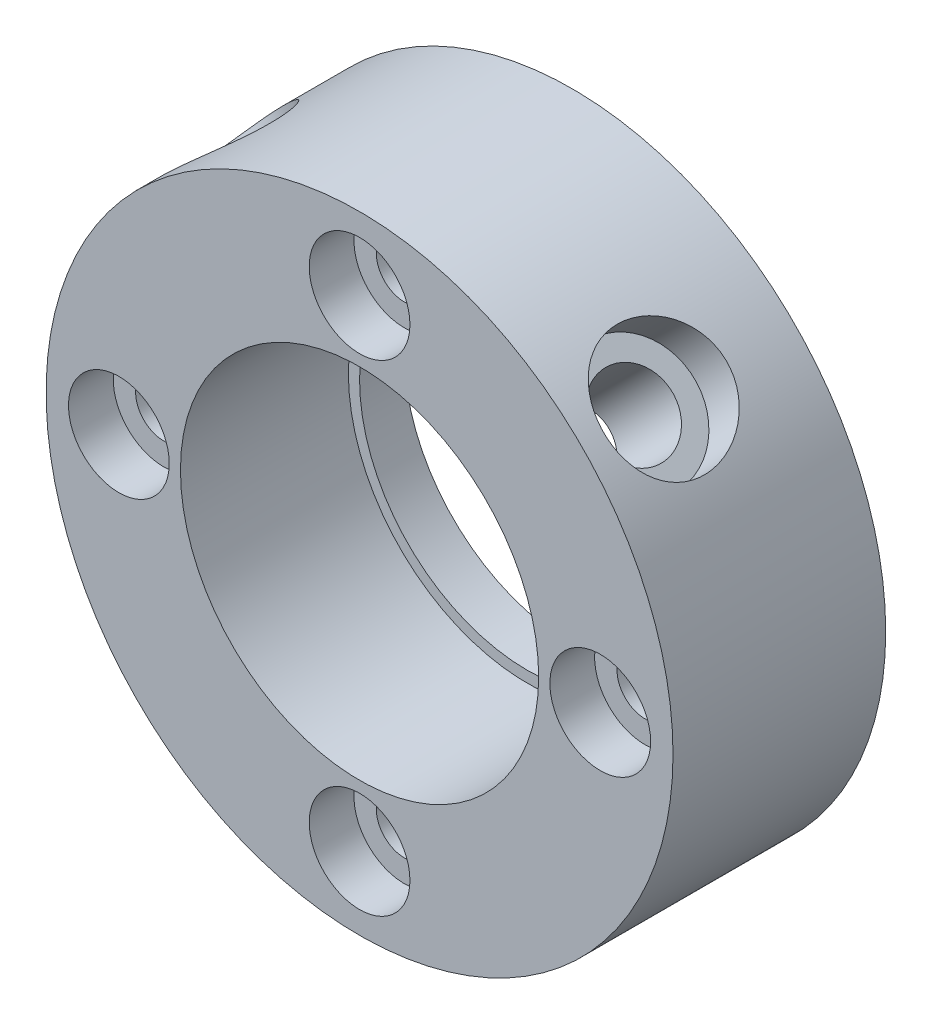
ISO-10303-21;
HEADER;
FILE_DESCRIPTION(('STEP AP214'),'2;1');
FILE_NAME('part.step','',(''),(''),'','','');
FILE_SCHEMA(('AUTOMOTIVE_DESIGN { 1 0 10303 214 1 1 1 1 }'));
ENDSEC;
DATA;
#1=APPLICATION_CONTEXT('core data for automotive mechanical design processes');
#2=APPLICATION_PROTOCOL_DEFINITION('international standard','automotive_design',2000,#1);
#3=PRODUCT_CONTEXT('',#1,'mechanical');
#4=PRODUCT('Part','Part','',(#3));
#5=PRODUCT_RELATED_PRODUCT_CATEGORY('part','',(#4));
#6=PRODUCT_DEFINITION_FORMATION('','',#4);
#7=PRODUCT_DEFINITION_CONTEXT('part definition',#1,'design');
#8=PRODUCT_DEFINITION('design','',#6,#7);
#9=PRODUCT_DEFINITION_SHAPE('','',#8);
#10=(LENGTH_UNIT() NAMED_UNIT(*) SI_UNIT(.MILLI.,.METRE.));
#11=(NAMED_UNIT(*) PLANE_ANGLE_UNIT() SI_UNIT($,.RADIAN.));
#12=(NAMED_UNIT(*) SI_UNIT($,.STERADIAN.) SOLID_ANGLE_UNIT());
#13=UNCERTAINTY_MEASURE_WITH_UNIT(LENGTH_MEASURE(1.E-05),#10,'distance_accuracy_value','');
#14=(GEOMETRIC_REPRESENTATION_CONTEXT(3) GLOBAL_UNCERTAINTY_ASSIGNED_CONTEXT((#13)) GLOBAL_UNIT_ASSIGNED_CONTEXT((#10,
#11,#12)) REPRESENTATION_CONTEXT('',''));
#15=CARTESIAN_POINT('',(0.,0.,0.));
#16=DIRECTION('',(0.,0.,1.));
#17=DIRECTION('',(1.,0.,0.));
#18=AXIS2_PLACEMENT_3D('',#15,#16,#17);
#19=CARTESIAN_POINT('',(-4.94974746830585,4.94974746830582,5.75));
#20=DIRECTION('',(-0.707106781186549,0.707106781186546,0.));
#21=DIRECTION('',(-0.707106781186546,-0.707106781186549,0.));
#22=AXIS2_PLACEMENT_3D('',#19,#20,#21);
#23=CYLINDRICAL_SURFACE('',#22,1.75);
#24=CARTESIAN_POINT('',(-6.75728740853137,4.28241367437843,5.75));
#25=CARTESIAN_POINT('',(-6.7572864358189,4.28241742043915,5.6529719865672));
#26=CARTESIAN_POINT('',(-6.75285509491892,4.28943219210488,5.55590386868923));
#27=CARTESIAN_POINT('',(-6.73515694329336,4.31716593041878,5.36452809547803));
#28=CARTESIAN_POINT('',(-6.72188374551932,4.33789480358069,5.2702224871333));
#29=CARTESIAN_POINT('',(-6.68662088146166,4.39205386093303,5.08716775159997));
#30=CARTESIAN_POINT('',(-6.66464077981807,4.42547010622337,4.99841265057484));
#31=CARTESIAN_POINT('',(-6.6121370674966,4.50353711713558,4.82873191615454));
#32=CARTESIAN_POINT('',(-6.58161363249329,4.54818765174743,4.74780612181319));
#33=CARTESIAN_POINT('',(-6.5117506986383,4.64767071106652,4.59471253780589));
#34=CARTESIAN_POINT('',(-6.47228443683237,4.70264747442849,4.52269629807493));
#35=CARTESIAN_POINT('',(-6.38521848127704,4.82019972127882,4.39079338749152));
#36=CARTESIAN_POINT('',(-6.33761815575134,4.88277579489965,4.33090765961146));
#37=CARTESIAN_POINT('',(-6.23438082445478,5.0139328586227,4.22436623233176));
#38=CARTESIAN_POINT('',(-6.17866456268551,5.08257008051205,4.17785629524105));
#39=CARTESIAN_POINT('',(-6.06058047843026,5.22281107829635,4.10032973697399));
#40=CARTESIAN_POINT('',(-5.99821340344953,5.29441452025671,4.06931137687435));
#41=CARTESIAN_POINT('',(-5.86926128775424,5.43699018131876,4.0241251174166));
#42=CARTESIAN_POINT('',(-5.80275767898808,5.50795470371953,4.00970073060677));
#43=CARTESIAN_POINT('',(-5.66643300556401,5.64810486238766,3.99730994048858));
#44=CARTESIAN_POINT('',(-5.59661232141431,5.7172907012948,3.99934165397865));
#45=CARTESIAN_POINT('',(-5.45694065885707,5.85072421217797,4.01961437044523));
#46=CARTESIAN_POINT('',(-5.38711042051306,5.91503588865531,4.03757891107517));
#47=CARTESIAN_POINT('',(-5.2484313985945,6.03842596202248,4.0887667801185));
#48=CARTESIAN_POINT('',(-5.17958265954779,6.09750412211241,4.12199079855425));
#49=CARTESIAN_POINT('',(-5.04462045156653,6.2096349145785,4.2029990480669));
#50=CARTESIAN_POINT('',(-4.97853069129534,6.26264027931818,4.25088806992256));
#51=CARTESIAN_POINT('',(-4.85187975514392,6.36126682027887,4.35978878699777));
#52=CARTESIAN_POINT('',(-4.7913193341689,6.40688698887505,4.42080227025849));
#53=CARTESIAN_POINT('',(-4.6767093904802,6.49103666483952,4.55572505085902));
#54=CARTESIAN_POINT('',(-4.62282160112356,6.52939884402311,4.62987630560751));
#55=CARTESIAN_POINT('',(-4.52519370150899,6.59743687627675,4.78817892039438));
#56=CARTESIAN_POINT('',(-4.48145386643818,6.6271124937947,4.87233055152438));
#57=CARTESIAN_POINT('',(-4.40587953681626,6.67759738871819,5.04862144608706));
#58=CARTESIAN_POINT('',(-4.37408071094507,6.69838012782498,5.14078364370769));
#59=CARTESIAN_POINT('',(-4.32406351384026,6.73077796444658,5.33025868273823));
#60=CARTESIAN_POINT('',(-4.30584298783509,6.74239451658183,5.42757070428457));
#61=CARTESIAN_POINT('',(-4.28410636016127,6.75622653145643,5.6224569275024));
#62=CARTESIAN_POINT('',(-4.28029798613782,6.75862886838208,5.7199853182606));
#63=CARTESIAN_POINT('',(-4.28676262845681,6.75453036478645,5.9143807036213));
#64=CARTESIAN_POINT('',(-4.29703467722516,6.74803013602893,6.01124774321065));
#65=CARTESIAN_POINT('',(-4.33095199526394,6.72631015249794,6.20039091520493));
#66=CARTESIAN_POINT('',(-4.3544374889898,6.71119454594867,6.29270782401673));
#67=CARTESIAN_POINT('',(-4.41359430759669,6.67243793646259,6.4714579700726));
#68=CARTESIAN_POINT('',(-4.44926679906692,6.64879611734983,6.55789064310333));
#69=CARTESIAN_POINT('',(-4.53192156437374,6.59273913643557,6.72388497843437));
#70=CARTESIAN_POINT('',(-4.57906951618442,6.56019449772474,6.80332035921827));
#71=CARTESIAN_POINT('',(-4.68248056226202,6.48678561819451,6.95173168369394));
#72=CARTESIAN_POINT('',(-4.73874478865659,6.4459203438939,7.02070632623003));
#73=CARTESIAN_POINT('',(-4.85940010318161,6.35547083683945,7.14755337012295));
#74=CARTESIAN_POINT('',(-4.92392316242068,6.30573823908874,7.20519478022894));
#75=CARTESIAN_POINT('',(-5.05786425533932,6.19881772864504,7.30608724272948));
#76=CARTESIAN_POINT('',(-5.12728206021031,6.14163016433416,7.349338967241));
#77=CARTESIAN_POINT('',(-5.26809773476028,6.0212674911324,7.41990264693481));
#78=CARTESIAN_POINT('',(-5.33947995074544,5.95813336776877,7.44731558387298));
#79=CARTESIAN_POINT('',(-5.48223283765318,5.82704937705271,7.4857388611449));
#80=CARTESIAN_POINT('',(-5.55360350874495,5.7591002114348,7.49675158648308));
#81=CARTESIAN_POINT('',(-5.69260216321536,5.62171092173696,7.50195457827283));
#82=CARTESIAN_POINT('',(-5.76027710418475,5.55233113744565,7.49648972318037));
#83=CARTESIAN_POINT('',(-5.89156954835449,5.4128168134945,7.46966411740783));
#84=CARTESIAN_POINT('',(-5.95518712449669,5.34268228742965,7.44830365258081));
#85=CARTESIAN_POINT('',(-6.07664791203298,5.2041156005644,7.39045845606348));
#86=CARTESIAN_POINT('',(-6.13450905774763,5.1356786852191,7.35402264734774));
#87=CARTESIAN_POINT('',(-6.24357328681382,5.0025202413903,7.26710874006052));
#88=CARTESIAN_POINT('',(-6.29477572302233,4.93779907437181,7.21662927811655));
#89=CARTESIAN_POINT('',(-6.39064384827594,4.81310512931095,7.10193650784483));
#90=CARTESIAN_POINT('',(-6.43516700216799,4.7532458099922,7.03748068449274));
#91=CARTESIAN_POINT('',(-6.51595605704299,4.64188119877392,6.89715399963899));
#92=CARTESIAN_POINT('',(-6.55221996499043,4.59037792412896,6.82128039023581));
#93=CARTESIAN_POINT('',(-6.61655938010037,4.49715481968186,6.6590516072625));
#94=CARTESIAN_POINT('',(-6.64451888710902,4.45557504840139,6.57256982229047));
#95=CARTESIAN_POINT('',(-6.69133209768394,4.38496104880476,6.39237797670048));
#96=CARTESIAN_POINT('',(-6.71019350772666,4.35591620507398,6.29867411180724));
#97=CARTESIAN_POINT('',(-6.73537258309256,4.31684547391851,6.12906263930061));
#98=CARTESIAN_POINT('',(-6.74358595705933,4.30396939286267,6.05407494852323));
#99=CARTESIAN_POINT('',(-6.7545436193223,4.28675222671176,5.90273307766719));
#100=CARTESIAN_POINT('',(-6.75728817423572,4.28241072553687,5.82637896438781));
#101=CARTESIAN_POINT('',(-6.75728740853137,4.28241367437843,5.75));
#102=B_SPLINE_CURVE_WITH_KNOTS('',3,(#24,#25,#26,#27,#28,#29,#30,#31,#32,#33,#34,#35,#36,#37,
#38,#39,#40,#41,#42,#43,#44,#45,#46,#47,#48,#49,#50,#51,#52,#53,#54,#55,#56,#57,#58,#59,#60,#61,
#62,#63,#64,#65,#66,#67,#68,#69,#70,#71,#72,#73,#74,#75,#76,#77,#78,#79,#80,#81,#82,#83,#84,#85,
#86,#87,#88,#89,#90,#91,#92,#93,#94,#95,#96,#97,#98,#99,#100,#101),.UNSPECIFIED.,.T.,.F.,(4,2,2,
2,2,2,2,2,2,2,2,2,2,2,2,2,2,2,2,2,2,2,2,2,2,2,2,2,2,2,2,2,2,2,2,2,2,2,4),(0.,0.290804115870691,
0.581818526599535,0.872514137052688,1.16320377043854,1.45830491896335,1.75342899855111,
2.05165686348641,2.34985124493559,2.64337184515389,2.93685885596571,3.2253508676411,
3.51385592599757,3.8044726414071,4.09512897475707,4.39183436537594,4.68854780096224,
4.98614062158782,5.28368620646371,5.57516431760517,5.86662240004893,6.15462969113393,
6.44266455918166,6.7351342450112,7.02764027980829,7.32560034403599,7.62354648911712,
7.91957146995089,8.21555339708043,8.50538367763981,8.79520874626514,9.08410055231566,
9.37302041407615,9.66742474155351,9.96190003653334,10.2603137141584,10.5584741768494,
10.7874018788084,11.0163184197546),.UNSPECIFIED.);
#103=CARTESIAN_POINT('',(-6.75728740853137,4.28241367437843,5.75));
#104=VERTEX_POINT('',#103);
#105=EDGE_CURVE('E115',#104,#104,#102,.T.);
#106=ORIENTED_EDGE('',*,*,#105,.T.);
#107=EDGE_LOOP('',(#106));
#108=FACE_BOUND('',#107,.T.);
#109=CARTESIAN_POINT('',(-8.48528137423859,8.48528137423855,5.75));
#110=DIRECTION('',(-0.707106781186549,0.707106781186546,0.));
#111=DIRECTION('',(-0.707106781186546,-0.707106781186549,0.));
#112=AXIS2_PLACEMENT_3D('',#109,#110,#111);
#113=CIRCLE('',#112,1.75);
#114=CARTESIAN_POINT('',(-9.72271824131504,7.24784450716209,5.75));
#115=VERTEX_POINT('',#114);
#116=EDGE_CURVE('E66',#115,#115,#113,.F.);
#117=ORIENTED_EDGE('',*,*,#116,.F.);
#118=EDGE_LOOP('',(#117));
#119=FACE_BOUND('',#118,.T.);
#120=ADVANCED_FACE('F36',(#108,#119),#23,.F.);
#121=CARTESIAN_POINT('',(4.94974746830582,4.94974746830584,5.75));
#122=DIRECTION('',(0.707106781186546,0.707106781186549,0.));
#123=DIRECTION('',(-0.707106781186549,0.707106781186546,0.));
#124=AXIS2_PLACEMENT_3D('',#121,#122,#123);
#125=CYLINDRICAL_SURFACE('',#124,1.75);
#126=CARTESIAN_POINT('',(4.28241367437843,6.75728740853137,5.75));
#127=CARTESIAN_POINT('',(4.28241742043916,6.7572864358189,5.6529719865672));
#128=CARTESIAN_POINT('',(4.28943219210489,6.75285509491892,5.55590386868923));
#129=CARTESIAN_POINT('',(4.31716593041878,6.73515694329336,5.36452809547803));
#130=CARTESIAN_POINT('',(4.33789480358069,6.72188374551932,5.2702224871333));
#131=CARTESIAN_POINT('',(4.39205386093303,6.68662088146166,5.08716775159997));
#132=CARTESIAN_POINT('',(4.42547010622338,6.66464077981807,4.99841265057484));
#133=CARTESIAN_POINT('',(4.50353711713558,6.6121370674966,4.82873191615454));
#134=CARTESIAN_POINT('',(4.54818765174744,6.58161363249329,4.74780612181319));
#135=CARTESIAN_POINT('',(4.64767071106652,6.5117506986383,4.59471253780589));
#136=CARTESIAN_POINT('',(4.70264747442849,6.47228443683237,4.52269629807493));
#137=CARTESIAN_POINT('',(4.82019972127882,6.38521848127704,4.39079338749152));
#138=CARTESIAN_POINT('',(4.88277579489965,6.33761815575134,4.33090765961146));
#139=CARTESIAN_POINT('',(5.0139328586227,6.23438082445478,4.22436623233177));
#140=CARTESIAN_POINT('',(5.08257008051205,6.17866456268551,4.17785629524105));
#141=CARTESIAN_POINT('',(5.22281107829635,6.06058047843026,4.10032973697399));
#142=CARTESIAN_POINT('',(5.29441452025671,5.99821340344953,4.06931137687435));
#143=CARTESIAN_POINT('',(5.43699018131876,5.86926128775424,4.0241251174166));
#144=CARTESIAN_POINT('',(5.50795470371953,5.80275767898808,4.00970073060678));
#145=CARTESIAN_POINT('',(5.64810486238766,5.66643300556401,3.99730994048858));
#146=CARTESIAN_POINT('',(5.7172907012948,5.59661232141432,3.99934165397865));
#147=CARTESIAN_POINT('',(5.85072421217797,5.45694065885707,4.01961437044523));
#148=CARTESIAN_POINT('',(5.91503588865531,5.38711042051306,4.03757891107517));
#149=CARTESIAN_POINT('',(6.03842596202248,5.2484313985945,4.0887667801185));
#150=CARTESIAN_POINT('',(6.09750412211241,5.17958265954779,4.12199079855425));
#151=CARTESIAN_POINT('',(6.2096349145785,5.04462045156653,4.2029990480669));
#152=CARTESIAN_POINT('',(6.26264027931818,4.97853069129534,4.25088806992256));
#153=CARTESIAN_POINT('',(6.36126682027887,4.85187975514392,4.35978878699777));
#154=CARTESIAN_POINT('',(6.40688698887505,4.7913193341689,4.42080227025849));
#155=CARTESIAN_POINT('',(6.49103666483952,4.6767093904802,4.55572505085902));
#156=CARTESIAN_POINT('',(6.5293988440231,4.62282160112356,4.62987630560751));
#157=CARTESIAN_POINT('',(6.59743687627675,4.52519370150899,4.78817892039438));
#158=CARTESIAN_POINT('',(6.6271124937947,4.48145386643818,4.87233055152438));
#159=CARTESIAN_POINT('',(6.67759738871819,4.40587953681626,5.04862144608706));
#160=CARTESIAN_POINT('',(6.69838012782498,4.37408071094507,5.14078364370769));
#161=CARTESIAN_POINT('',(6.73077796444658,4.32406351384026,5.33025868273823));
#162=CARTESIAN_POINT('',(6.74239451658183,4.30584298783509,5.42757070428457));
#163=CARTESIAN_POINT('',(6.75622653145643,4.28410636016127,5.6224569275024));
#164=CARTESIAN_POINT('',(6.75862886838208,4.28029798613782,5.71998531826059));
#165=CARTESIAN_POINT('',(6.75453036478645,4.28676262845681,5.9143807036213));
#166=CARTESIAN_POINT('',(6.74803013602893,4.29703467722516,6.01124774321065));
#167=CARTESIAN_POINT('',(6.72631015249794,4.33095199526394,6.20039091520493));
#168=CARTESIAN_POINT('',(6.71119454594867,4.3544374889898,6.29270782401673));
#169=CARTESIAN_POINT('',(6.67243793646259,4.41359430759668,6.4714579700726));
#170=CARTESIAN_POINT('',(6.64879611734983,4.44926679906692,6.55789064310333));
#171=CARTESIAN_POINT('',(6.59273913643557,4.53192156437374,6.72388497843437));
#172=CARTESIAN_POINT('',(6.56019449772474,4.57906951618442,6.80332035921827));
#173=CARTESIAN_POINT('',(6.48678561819451,4.68248056226202,6.95173168369394));
#174=CARTESIAN_POINT('',(6.44592034389391,4.73874478865659,7.02070632623003));
#175=CARTESIAN_POINT('',(6.35547083683945,4.85940010318161,7.14755337012295));
#176=CARTESIAN_POINT('',(6.30573823908874,4.92392316242068,7.20519478022894));
#177=CARTESIAN_POINT('',(6.19881772864504,5.05786425533932,7.30608724272948));
#178=CARTESIAN_POINT('',(6.14163016433417,5.12728206021031,7.349338967241));
#179=CARTESIAN_POINT('',(6.0212674911324,5.26809773476028,7.41990264693481));
#180=CARTESIAN_POINT('',(5.95813336776877,5.33947995074543,7.44731558387298));
#181=CARTESIAN_POINT('',(5.82704937705271,5.48223283765317,7.4857388611449));
#182=CARTESIAN_POINT('',(5.7591002114348,5.55360350874494,7.49675158648308));
#183=CARTESIAN_POINT('',(5.62171092173696,5.69260216321536,7.50195457827283));
#184=CARTESIAN_POINT('',(5.55233113744565,5.76027710418475,7.49648972318037));
#185=CARTESIAN_POINT('',(5.4128168134945,5.89156954835449,7.46966411740783));
#186=CARTESIAN_POINT('',(5.34268228742965,5.95518712449669,7.44830365258081));
#187=CARTESIAN_POINT('',(5.2041156005644,6.07664791203298,7.39045845606348));
#188=CARTESIAN_POINT('',(5.1356786852191,6.13450905774763,7.35402264734775));
#189=CARTESIAN_POINT('',(5.0025202413903,6.24357328681382,7.26710874006052));
#190=CARTESIAN_POINT('',(4.93779907437181,6.29477572302233,7.21662927811655));
#191=CARTESIAN_POINT('',(4.81310512931095,6.39064384827593,7.10193650784483));
#192=CARTESIAN_POINT('',(4.7532458099922,6.43516700216799,7.03748068449274));
#193=CARTESIAN_POINT('',(4.64188119877392,6.51595605704299,6.897153999639));
#194=CARTESIAN_POINT('',(4.59037792412896,6.55221996499043,6.82128039023581));
#195=CARTESIAN_POINT('',(4.49715481968186,6.61655938010037,6.6590516072625));
#196=CARTESIAN_POINT('',(4.45557504840139,6.64451888710902,6.57256982229047));
#197=CARTESIAN_POINT('',(4.38496104880476,6.69133209768394,6.39237797670048));
#198=CARTESIAN_POINT('',(4.35591620507398,6.71019350772666,6.29867411180724));
#199=CARTESIAN_POINT('',(4.31684547391851,6.73537258309256,6.12906263930061));
#200=CARTESIAN_POINT('',(4.30396939286267,6.74358595705933,6.05407494852323));
#201=CARTESIAN_POINT('',(4.28675222671176,6.75454361932229,5.90273307766719));
#202=CARTESIAN_POINT('',(4.28241072553687,6.75728817423571,5.82637896438781));
#203=CARTESIAN_POINT('',(4.28241367437843,6.75728740853137,5.75));
#204=B_SPLINE_CURVE_WITH_KNOTS('',3,(#126,#127,#128,#129,#130,#131,#132,#133,#134,#135,#136,
#137,#138,#139,#140,#141,#142,#143,#144,#145,#146,#147,#148,#149,#150,#151,#152,#153,#154,#155,
#156,#157,#158,#159,#160,#161,#162,#163,#164,#165,#166,#167,#168,#169,#170,#171,#172,#173,#174,
#175,#176,#177,#178,#179,#180,#181,#182,#183,#184,#185,#186,#187,#188,#189,#190,#191,#192,#193,
#194,#195,#196,#197,#198,#199,#200,#201,#202,#203),.UNSPECIFIED.,.T.,.F.,(4,2,2,2,2,2,2,2,2,2,2,
2,2,2,2,2,2,2,2,2,2,2,2,2,2,2,2,2,2,2,2,2,2,2,2,2,2,2,4),(0.,0.290804115870692,
0.581818526599534,0.872514137052688,1.16320377043854,1.45830491896335,1.75342899855111,
2.05165686348641,2.34985124493558,2.64337184515389,2.93685885596571,3.2253508676411,
3.51385592599757,3.8044726414071,4.09512897475707,4.39183436537594,4.68854780096223,
4.98614062158781,5.28368620646371,5.57516431760516,5.86662240004893,6.15462969113392,
6.44266455918165,6.73513424501119,7.02764027980828,7.32560034403598,7.62354648911712,
7.91957146995089,8.21555339708042,8.5053836776398,8.79520874626514,9.08410055231566,
9.37302041407614,9.6674247415535,9.96190003653333,10.2603137141584,10.5584741768494,
10.7874018788084,11.0163184197546),.UNSPECIFIED.);
#205=CARTESIAN_POINT('',(4.28241367437843,6.75728740853137,5.75));
#206=VERTEX_POINT('',#205);
#207=EDGE_CURVE('E123',#206,#206,#204,.T.);
#208=ORIENTED_EDGE('',*,*,#207,.T.);
#209=EDGE_LOOP('',(#208));
#210=FACE_BOUND('',#209,.T.);
#211=CARTESIAN_POINT('',(8.48528137423855,8.48528137423859,5.75));
#212=DIRECTION('',(0.707106781186546,0.707106781186549,0.));
#213=DIRECTION('',(-0.707106781186549,0.707106781186546,0.));
#214=AXIS2_PLACEMENT_3D('',#211,#212,#213);
#215=CIRCLE('',#214,1.75);
#216=CARTESIAN_POINT('',(7.24784450716209,9.72271824131504,5.75));
#217=VERTEX_POINT('',#216);
#218=EDGE_CURVE('E64',#217,#217,#215,.F.);
#219=ORIENTED_EDGE('',*,*,#218,.F.);
#220=EDGE_LOOP('',(#219));
#221=FACE_BOUND('',#220,.T.);
#222=ADVANCED_FACE('F110',(#210,#221),#125,.F.);
#223=CARTESIAN_POINT('',(-10.75,0.,0.));
#224=DIRECTION('',(0.,0.,1.));
#225=DIRECTION('',(1.,0.,0.));
#226=AXIS2_PLACEMENT_3D('',#223,#224,#225);
#227=CYLINDRICAL_SURFACE('',#226,1.25);
#228=CARTESIAN_POINT('',(-10.75,0.,0.));
#229=DIRECTION('',(0.,0.,1.));
#230=DIRECTION('',(1.,0.,0.));
#231=AXIS2_PLACEMENT_3D('',#228,#229,#230);
#232=CIRCLE('',#231,1.25);
#233=CARTESIAN_POINT('',(-9.5,0.,0.));
#234=VERTEX_POINT('',#233);
#235=EDGE_CURVE('E167',#234,#234,#232,.T.);
#236=ORIENTED_EDGE('',*,*,#235,.F.);
#237=EDGE_LOOP('',(#236));
#238=FACE_BOUND('',#237,.T.);
#239=CARTESIAN_POINT('',(-10.75,0.,7.5));
#240=DIRECTION('',(0.,0.,1.));
#241=DIRECTION('',(1.,0.,0.));
#242=AXIS2_PLACEMENT_3D('',#239,#240,#241);
#243=CIRCLE('',#242,1.25);
#244=CARTESIAN_POINT('',(-9.5,0.,7.5));
#245=VERTEX_POINT('',#244);
#246=EDGE_CURVE('E124',#245,#245,#243,.F.);
#247=ORIENTED_EDGE('',*,*,#246,.F.);
#248=EDGE_LOOP('',(#247));
#249=FACE_BOUND('',#248,.T.);
#250=ADVANCED_FACE('F248',(#238,#249),#227,.F.);
#251=CARTESIAN_POINT('',(0.,-10.75,0.));
#252=DIRECTION('',(0.,0.,1.));
#253=DIRECTION('',(1.,0.,0.));
#254=AXIS2_PLACEMENT_3D('',#251,#252,#253);
#255=CYLINDRICAL_SURFACE('',#254,1.25);
#256=CARTESIAN_POINT('',(0.,-10.75,0.));
#257=DIRECTION('',(0.,0.,1.));
#258=DIRECTION('',(1.,0.,0.));
#259=AXIS2_PLACEMENT_3D('',#256,#257,#258);
#260=CIRCLE('',#259,1.25);
#261=CARTESIAN_POINT('',(1.25,-10.75,0.));
#262=VERTEX_POINT('',#261);
#263=EDGE_CURVE('E163',#262,#262,#260,.T.);
#264=ORIENTED_EDGE('',*,*,#263,.F.);
#265=EDGE_LOOP('',(#264));
#266=FACE_BOUND('',#265,.T.);
#267=CARTESIAN_POINT('',(0.,-10.75,7.5));
#268=DIRECTION('',(0.,0.,1.));
#269=DIRECTION('',(1.,0.,0.));
#270=AXIS2_PLACEMENT_3D('',#267,#268,#269);
#271=CIRCLE('',#270,1.25);
#272=CARTESIAN_POINT('',(1.25,-10.75,7.5));
#273=VERTEX_POINT('',#272);
#274=EDGE_CURVE('E284',#273,#273,#271,.F.);
#275=ORIENTED_EDGE('',*,*,#274,.F.);
#276=EDGE_LOOP('',(#275));
#277=FACE_BOUND('',#276,.T.);
#278=ADVANCED_FACE('F253',(#266,#277),#255,.F.);
#279=CARTESIAN_POINT('',(10.75,0.,0.));
#280=DIRECTION('',(0.,0.,1.));
#281=DIRECTION('',(1.,0.,0.));
#282=AXIS2_PLACEMENT_3D('',#279,#280,#281);
#283=CYLINDRICAL_SURFACE('',#282,1.25);
#284=CARTESIAN_POINT('',(10.75,0.,0.));
#285=DIRECTION('',(0.,0.,1.));
#286=DIRECTION('',(1.,0.,0.));
#287=AXIS2_PLACEMENT_3D('',#284,#285,#286);
#288=CIRCLE('',#287,1.25);
#289=CARTESIAN_POINT('',(12.,0.,0.));
#290=VERTEX_POINT('',#289);
#291=EDGE_CURVE('E159',#290,#290,#288,.T.);
#292=ORIENTED_EDGE('',*,*,#291,.F.);
#293=EDGE_LOOP('',(#292));
#294=FACE_BOUND('',#293,.T.);
#295=CARTESIAN_POINT('',(10.75,0.,7.5));
#296=DIRECTION('',(0.,0.,1.));
#297=DIRECTION('',(1.,0.,0.));
#298=AXIS2_PLACEMENT_3D('',#295,#296,#297);
#299=CIRCLE('',#298,1.25);
#300=CARTESIAN_POINT('',(12.,0.,7.5));
#301=VERTEX_POINT('',#300);
#302=EDGE_CURVE('E282',#301,#301,#299,.F.);
#303=ORIENTED_EDGE('',*,*,#302,.F.);
#304=EDGE_LOOP('',(#303));
#305=FACE_BOUND('',#304,.T.);
#306=ADVANCED_FACE('F267',(#294,#305),#283,.F.);
#307=CARTESIAN_POINT('',(0.,10.75,0.));
#308=DIRECTION('',(0.,0.,1.));
#309=DIRECTION('',(1.,0.,0.));
#310=AXIS2_PLACEMENT_3D('',#307,#308,#309);
#311=CYLINDRICAL_SURFACE('',#310,1.25);
#312=CARTESIAN_POINT('',(0.,10.75,0.));
#313=DIRECTION('',(0.,0.,1.));
#314=DIRECTION('',(1.,0.,0.));
#315=AXIS2_PLACEMENT_3D('',#312,#313,#314);
#316=CIRCLE('',#315,1.25);
#317=CARTESIAN_POINT('',(1.25,10.75,0.));
#318=VERTEX_POINT('',#317);
#319=EDGE_CURVE('E155',#318,#318,#316,.T.);
#320=ORIENTED_EDGE('',*,*,#319,.F.);
#321=EDGE_LOOP('',(#320));
#322=FACE_BOUND('',#321,.T.);
#323=CARTESIAN_POINT('',(0.,10.75,7.5));
#324=DIRECTION('',(0.,0.,1.));
#325=DIRECTION('',(1.,0.,0.));
#326=AXIS2_PLACEMENT_3D('',#323,#324,#325);
#327=CIRCLE('',#326,1.25);
#328=CARTESIAN_POINT('',(1.25,10.75,7.5));
#329=VERTEX_POINT('',#328);
#330=EDGE_CURVE('E128',#329,#329,#327,.F.);
#331=ORIENTED_EDGE('',*,*,#330,.F.);
#332=EDGE_LOOP('',(#331));
#333=FACE_BOUND('',#332,.T.);
#334=ADVANCED_FACE('F151',(#322,#333),#311,.F.);
#335=CARTESIAN_POINT('',(0.,0.,2.));
#336=DIRECTION('',(0.,0.,-1.));
#337=DIRECTION('',(-1.,0.,0.));
#338=AXIS2_PLACEMENT_3D('',#335,#336,#337);
#339=CYLINDRICAL_SURFACE('',#338,14.);
#340=CARTESIAN_POINT('',(-11.6511779774216,7.76209068089556,5.75));
#341=CARTESIAN_POINT('',(-11.6511760710743,7.76209685743818,5.59713864487768));
#342=CARTESIAN_POINT('',(-11.6439600918152,7.77295873329219,5.44420467965564));
#343=CARTESIAN_POINT('',(-11.6151562478213,7.81593176789737,5.14265905280335));
#344=CARTESIAN_POINT('',(-11.5935566814567,7.84806022774672,4.99405101331165));
#345=CARTESIAN_POINT('',(-11.5362296800744,7.9320849840361,4.70556360702522));
#346=CARTESIAN_POINT('',(-11.5005160354634,7.9839619830083,4.5656758739027));
#347=CARTESIAN_POINT('',(-11.4153350658881,8.10528188694974,4.29828223466166));
#348=CARTESIAN_POINT('',(-11.3658685973735,8.17472369805544,4.1707755581864));
#349=CARTESIAN_POINT('',(-11.2530317647504,8.32937722105698,3.9300161059738));
#350=CARTESIAN_POINT('',(-11.1894986642951,8.4147715125977,3.81695685091667));
#351=CARTESIAN_POINT('',(-11.0496963781696,8.59752415467707,3.60999006066215));
#352=CARTESIAN_POINT('',(-10.9734263172008,8.69488332733456,3.51608384266932));
#353=CARTESIAN_POINT('',(-10.8086291445262,8.89892412332568,3.34934056719733));
#354=CARTESIAN_POINT('',(-10.7200045154781,9.00567714337162,3.27668699234182));
#355=CARTESIAN_POINT('',(-10.5327025177477,9.22403606803344,3.15569481193111));
#356=CARTESIAN_POINT('',(-10.4340260574771,9.33564153359888,3.10735401150367));
#357=CARTESIAN_POINT('',(-10.2302260166266,9.55850280250496,3.03696085636299));
#358=CARTESIAN_POINT('',(-10.125200430248,9.669744990088,3.01458187495326));
#359=CARTESIAN_POINT('',(-9.91038456070153,9.88978808390079,2.99572894559391));
#360=CARTESIAN_POINT('',(-9.80059472202804,9.99858921644498,2.99925258612951));
#361=CARTESIAN_POINT('',(-9.58102744775139,10.2091500460516,3.0318563354567));
#362=CARTESIAN_POINT('',(-9.47127056618951,10.3109859487607,3.06058465450608));
#363=CARTESIAN_POINT('',(-9.25368197503286,10.5067024995948,3.14222474936271));
#364=CARTESIAN_POINT('',(-9.14585034068459,10.6005828373187,3.19513746825414));
#365=CARTESIAN_POINT('',(-8.93496579021392,10.7789421572765,3.32397297266082));
#366=CARTESIAN_POINT('',(-8.83194610420595,10.8633601811193,3.40003439842101));
#367=CARTESIAN_POINT('',(-8.6348846554936,11.0206482091051,3.57290575092377));
#368=CARTESIAN_POINT('',(-8.54084389264235,11.0935169277635,3.66971798449848));
#369=CARTESIAN_POINT('',(-8.36359389448011,11.2277730733744,3.88327523820785));
#370=CARTESIAN_POINT('',(-8.28059342328153,11.2889467968924,4.00032810568758));
#371=CARTESIAN_POINT('',(-8.13053710814367,11.3974983784731,4.25002375031689));
#372=CARTESIAN_POINT('',(-8.06348154485832,11.4448759937072,4.38266680181535));
#373=CARTESIAN_POINT('',(-7.9479795776025,11.5253898480945,4.66019695454488));
#374=CARTESIAN_POINT('',(-7.89957076518362,11.5584973347093,4.80510807845731));
#375=CARTESIAN_POINT('',(-7.82372493303534,11.6099720242653,5.10281950411177));
#376=CARTESIAN_POINT('',(-7.79628528514657,11.6283410744552,5.25561881462842));
#377=CARTESIAN_POINT('',(-7.76393296601738,11.6499665945253,5.56206569919598));
#378=CARTESIAN_POINT('',(-7.75865572008286,11.6534676558465,5.71565758188245));
#379=CARTESIAN_POINT('',(-7.76987377383254,11.6459909608475,6.02168243713359));
#380=CARTESIAN_POINT('',(-7.78636788530818,11.6350139946901,6.17411547248767));
#381=CARTESIAN_POINT('',(-7.84010957468696,11.5988664947171,6.47205705658004));
#382=CARTESIAN_POINT('',(-7.87716491147389,11.5738274114488,6.61761639167118));
#383=CARTESIAN_POINT('',(-7.97027158902165,11.5099061771373,6.89931251813333));
#384=CARTESIAN_POINT('',(-8.02632444711121,11.4710229203497,7.03544855582098));
#385=CARTESIAN_POINT('',(-8.15593958330598,11.3792359676262,7.29632225600289));
#386=CARTESIAN_POINT('',(-8.229713598075,11.3261617735526,7.42089467042176));
#387=CARTESIAN_POINT('',(-8.39149189120413,11.2068257799823,7.65337678166906));
#388=CARTESIAN_POINT('',(-8.47949757981278,11.1405626734163,7.76128482511373));
#389=CARTESIAN_POINT('',(-8.66788418245452,10.9946423388,7.95900125477127));
#390=CARTESIAN_POINT('',(-8.76842864337674,10.9148017777596,8.04851884805999));
#391=CARTESIAN_POINT('',(-8.97720229742934,10.7437434762889,8.20485372190564));
#392=CARTESIAN_POINT('',(-9.085431175118,10.6525262027513,8.27167193361096));
#393=CARTESIAN_POINT('',(-9.30519361072118,10.4610931191872,8.38028411926557));
#394=CARTESIAN_POINT('',(-9.41670517858037,10.3609307606668,8.42221661584114));
#395=CARTESIAN_POINT('',(-9.63990993584737,10.1535865474959,8.48030692396769));
#396=CARTESIAN_POINT('',(-9.75160310268625,10.0464055084653,8.49646772485652));
#397=CARTESIAN_POINT('',(-9.96983508695565,9.82983362934317,8.50244353036993));
#398=CARTESIAN_POINT('',(-10.0764289582517,9.72051010286401,8.49269630858576));
#399=CARTESIAN_POINT('',(-10.2834877072507,9.50119100225685,8.44809707740773));
#400=CARTESIAN_POINT('',(-10.3839526564767,9.39119543598788,8.41324536103783));
#401=CARTESIAN_POINT('',(-10.5761187560898,9.17424036262302,8.31961812143022));
#402=CARTESIAN_POINT('',(-10.6678380278224,9.06727491541163,8.26089345488584));
#403=CARTESIAN_POINT('',(-10.8409023167005,8.85963471236125,8.12124177050664));
#404=CARTESIAN_POINT('',(-10.9222465491039,8.75896043266396,8.04031307467129));
#405=CARTESIAN_POINT('',(-11.0743849957406,8.56582542357789,7.85706506634693));
#406=CARTESIAN_POINT('',(-11.1449947627056,8.47351738730983,7.75443165263271));
#407=CARTESIAN_POINT('',(-11.2731371218947,8.30227954812328,7.53133486969797));
#408=CARTESIAN_POINT('',(-11.3306666202923,8.2233529113769,7.41086729333251));
#409=CARTESIAN_POINT('',(-11.4324685887437,8.08123775287278,7.15403136397606));
#410=CARTESIAN_POINT('',(-11.476598111931,8.0182200631203,7.0175117382729));
#411=CARTESIAN_POINT('',(-11.550271244279,7.91172932739614,6.73345773398099));
#412=CARTESIAN_POINT('',(-11.5798282437361,7.86823834216193,6.58593361120005));
#413=CARTESIAN_POINT('',(-11.6183350585297,7.81121771647316,6.32337110652133));
#414=CARTESIAN_POINT('',(-11.6306426848372,7.79284092765964,6.20984220063522));
#415=CARTESIAN_POINT('',(-11.6470647322009,7.76827527357894,5.98088929870786));
#416=CARTESIAN_POINT('',(-11.6511794174002,7.7620860153819,5.86546536388394));
#417=CARTESIAN_POINT('',(-11.6511779774216,7.76209068089556,5.75));
#418=B_SPLINE_CURVE_WITH_KNOTS('',3,(#340,#341,#342,#343,#344,#345,#346,#347,#348,#349,#350,
#351,#352,#353,#354,#355,#356,#357,#358,#359,#360,#361,#362,#363,#364,#365,#366,#367,#368,#369,
#370,#371,#372,#373,#374,#375,#376,#377,#378,#379,#380,#381,#382,#383,#384,#385,#386,#387,#388,
#389,#390,#391,#392,#393,#394,#395,#396,#397,#398,#399,#400,#401,#402,#403,#404,#405,#406,#407,
#408,#409,#410,#411,#412,#413,#414,#415,#416,#417),.UNSPECIFIED.,.T.,.F.,(4,2,2,2,2,2,2,2,2,2,2,
2,2,2,2,2,2,2,2,2,2,2,2,2,2,2,2,2,2,2,2,2,2,2,2,2,2,2,4),(0.,0.458161359266158,
0.916695907427622,1.37478353967289,1.83284265114413,2.29650709300992,2.76020341155038,
3.22779223307661,3.69533883473926,4.15693714034928,4.61849247204569,5.07370641763774,
5.52893811606669,5.98695177036365,6.44501636769502,6.91078471215003,7.37656125420932,
7.84327194031395,8.30992412187866,8.76886898779822,9.22778880706281,9.68248845652962,
10.1372244313406,10.5976905575203,11.0582023403144,11.5255141630079,11.9928068138484,
12.4574733411489,12.9220859664357,13.3788980434201,13.8357047885022,14.291543452743,
14.7474165750679,15.2104037928827,15.6735004056529,16.141376409648,16.6088216900946,
16.9549096446048,17.3009864409468),.UNSPECIFIED.);
#419=CARTESIAN_POINT('',(-11.6511779774216,7.76209068089556,5.75));
#420=VERTEX_POINT('',#419);
#421=EDGE_CURVE('E10',#420,#420,#418,.T.);
#422=ORIENTED_EDGE('',*,*,#421,.T.);
#423=EDGE_LOOP('',(#422));
#424=FACE_BOUND('',#423,.T.);
#425=CARTESIAN_POINT('',(7.76209068089556,11.6511779774216,5.75));
#426=CARTESIAN_POINT('',(7.76209685743817,11.6511760710743,5.59713864487768));
#427=CARTESIAN_POINT('',(7.77295873329218,11.6439600918152,5.44420467965564));
#428=CARTESIAN_POINT('',(7.81593176789736,11.6151562478213,5.14265905280335));
#429=CARTESIAN_POINT('',(7.84806022774672,11.5935566814567,4.99405101331165));
#430=CARTESIAN_POINT('',(7.9320849840361,11.5362296800744,4.70556360702522));
#431=CARTESIAN_POINT('',(7.9839619830083,11.5005160354634,4.5656758739027));
#432=CARTESIAN_POINT('',(8.10528188694973,11.4153350658881,4.29828223466165));
#433=CARTESIAN_POINT('',(8.17472369805544,11.3658685973735,4.1707755581864));
#434=CARTESIAN_POINT('',(8.32937722105698,11.2530317647504,3.9300161059738));
#435=CARTESIAN_POINT('',(8.41477151259769,11.1894986642951,3.81695685091667));
#436=CARTESIAN_POINT('',(8.59752415467706,11.0496963781696,3.60999006066215));
#437=CARTESIAN_POINT('',(8.69488332733455,10.9734263172008,3.51608384266932));
#438=CARTESIAN_POINT('',(8.89892412332567,10.8086291445262,3.34934056719733));
#439=CARTESIAN_POINT('',(9.00567714337162,10.7200045154781,3.27668699234182));
#440=CARTESIAN_POINT('',(9.22403606803344,10.5327025177477,3.15569481193111));
#441=CARTESIAN_POINT('',(9.33564153359888,10.4340260574771,3.10735401150367));
#442=CARTESIAN_POINT('',(9.55850280250495,10.2302260166266,3.03696085636299));
#443=CARTESIAN_POINT('',(9.66974499008799,10.125200430248,3.01458187495326));
#444=CARTESIAN_POINT('',(9.88978808390079,9.91038456070153,2.99572894559391));
#445=CARTESIAN_POINT('',(9.99858921644498,9.80059472202804,2.99925258612951));
#446=CARTESIAN_POINT('',(10.2091500460516,9.58102744775139,3.0318563354567));
#447=CARTESIAN_POINT('',(10.3109859487607,9.47127056618951,3.06058465450608));
#448=CARTESIAN_POINT('',(10.5067024995948,9.25368197503287,3.14222474936271));
#449=CARTESIAN_POINT('',(10.6005828373187,9.14585034068459,3.19513746825414));
#450=CARTESIAN_POINT('',(10.7789421572765,8.93496579021392,3.32397297266082));
#451=CARTESIAN_POINT('',(10.8633601811193,8.83194610420596,3.40003439842101));
#452=CARTESIAN_POINT('',(11.0206482091051,8.6348846554936,3.57290575092377));
#453=CARTESIAN_POINT('',(11.0935169277635,8.54084389264235,3.66971798449848));
#454=CARTESIAN_POINT('',(11.2277730733744,8.36359389448011,3.88327523820785));
#455=CARTESIAN_POINT('',(11.2889467968924,8.28059342328153,4.00032810568758));
#456=CARTESIAN_POINT('',(11.3974983784731,8.13053710814367,4.25002375031689));
#457=CARTESIAN_POINT('',(11.4448759937072,8.06348154485832,4.38266680181535));
#458=CARTESIAN_POINT('',(11.5253898480945,7.9479795776025,4.66019695454488));
#459=CARTESIAN_POINT('',(11.5584973347093,7.89957076518363,4.80510807845731));
#460=CARTESIAN_POINT('',(11.6099720242653,7.82372493303534,5.10281950411177));
#461=CARTESIAN_POINT('',(11.6283410744552,7.79628528514657,5.25561881462842));
#462=CARTESIAN_POINT('',(11.6499665945253,7.76393296601738,5.56206569919598));
#463=CARTESIAN_POINT('',(11.6534676558465,7.75865572008286,5.71565758188245));
#464=CARTESIAN_POINT('',(11.6459909608475,7.76987377383254,6.02168243713359));
#465=CARTESIAN_POINT('',(11.6350139946901,7.78636788530818,6.17411547248767));
#466=CARTESIAN_POINT('',(11.5988664947171,7.84010957468696,6.47205705658004));
#467=CARTESIAN_POINT('',(11.5738274114488,7.87716491147389,6.61761639167118));
#468=CARTESIAN_POINT('',(11.5099061771373,7.97027158902165,6.89931251813333));
#469=CARTESIAN_POINT('',(11.4710229203497,8.02632444711121,7.03544855582098));
#470=CARTESIAN_POINT('',(11.3792359676262,8.15593958330598,7.29632225600289));
#471=CARTESIAN_POINT('',(11.3261617735526,8.22971359807501,7.42089467042177));
#472=CARTESIAN_POINT('',(11.2068257799823,8.39149189120414,7.65337678166906));
#473=CARTESIAN_POINT('',(11.1405626734163,8.47949757981278,7.76128482511373));
#474=CARTESIAN_POINT('',(10.9946423388,8.66788418245452,7.95900125477127));
#475=CARTESIAN_POINT('',(10.9148017777596,8.76842864337675,8.04851884805999));
#476=CARTESIAN_POINT('',(10.7437434762889,8.97720229742934,8.20485372190564));
#477=CARTESIAN_POINT('',(10.6525262027513,9.085431175118,8.27167193361096));
#478=CARTESIAN_POINT('',(10.4610931191872,9.30519361072118,8.38028411926557));
#479=CARTESIAN_POINT('',(10.3609307606668,9.41670517858037,8.42221661584114));
#480=CARTESIAN_POINT('',(10.1535865474959,9.63990993584737,8.48030692396769));
#481=CARTESIAN_POINT('',(10.0464055084653,9.75160310268626,8.49646772485652));
#482=CARTESIAN_POINT('',(9.82983362934317,9.96983508695565,8.50244353036994));
#483=CARTESIAN_POINT('',(9.72051010286401,10.0764289582517,8.49269630858576));
#484=CARTESIAN_POINT('',(9.50119100225685,10.2834877072507,8.44809707740773));
#485=CARTESIAN_POINT('',(9.39119543598788,10.3839526564767,8.41324536103783));
#486=CARTESIAN_POINT('',(9.17424036262301,10.5761187560898,8.31961812143022));
#487=CARTESIAN_POINT('',(9.06727491541162,10.6678380278224,8.26089345488584));
#488=CARTESIAN_POINT('',(8.85963471236125,10.8409023167005,8.12124177050664));
#489=CARTESIAN_POINT('',(8.75896043266396,10.9222465491039,8.04031307467129));
#490=CARTESIAN_POINT('',(8.56582542357788,11.0743849957406,7.85706506634693));
#491=CARTESIAN_POINT('',(8.47351738730982,11.1449947627056,7.75443165263271));
#492=CARTESIAN_POINT('',(8.30227954812328,11.2731371218947,7.53133486969797));
#493=CARTESIAN_POINT('',(8.2233529113769,11.3306666202923,7.41086729333251));
#494=CARTESIAN_POINT('',(8.08123775287278,11.4324685887437,7.15403136397606));
#495=CARTESIAN_POINT('',(8.01822006312029,11.476598111931,7.0175117382729));
#496=CARTESIAN_POINT('',(7.91172932739613,11.550271244279,6.73345773398099));
#497=CARTESIAN_POINT('',(7.86823834216192,11.5798282437361,6.58593361120005));
#498=CARTESIAN_POINT('',(7.81121771647315,11.6183350585297,6.32337110652133));
#499=CARTESIAN_POINT('',(7.79284092765964,11.6306426848372,6.20984220063522));
#500=CARTESIAN_POINT('',(7.76827527357894,11.6470647322009,5.98088929870786));
#501=CARTESIAN_POINT('',(7.7620860153819,11.6511794174002,5.86546536388394));
#502=CARTESIAN_POINT('',(7.76209068089556,11.6511779774216,5.75));
#503=B_SPLINE_CURVE_WITH_KNOTS('',3,(#425,#426,#427,#428,#429,#430,#431,#432,#433,#434,#435,
#436,#437,#438,#439,#440,#441,#442,#443,#444,#445,#446,#447,#448,#449,#450,#451,#452,#453,#454,
#455,#456,#457,#458,#459,#460,#461,#462,#463,#464,#465,#466,#467,#468,#469,#470,#471,#472,#473,
#474,#475,#476,#477,#478,#479,#480,#481,#482,#483,#484,#485,#486,#487,#488,#489,#490,#491,#492,
#493,#494,#495,#496,#497,#498,#499,#500,#501,#502),.UNSPECIFIED.,.T.,.F.,(4,2,2,2,2,2,2,2,2,2,2,
2,2,2,2,2,2,2,2,2,2,2,2,2,2,2,2,2,2,2,2,2,2,2,2,2,2,2,4),(0.,0.458161359266158,
0.916695907427623,1.37478353967289,1.83284265114413,2.29650709300992,2.76020341155038,
3.22779223307661,3.69533883473927,4.15693714034928,4.61849247204569,5.07370641763774,
5.52893811606669,5.98695177036366,6.44501636769503,6.91078471215003,7.37656125420933,
7.84327194031395,8.30992412187866,8.76886898779822,9.22778880706281,9.68248845652963,
10.1372244313406,10.5976905575203,11.0582023403144,11.5255141630079,11.9928068138484,
12.4574733411489,12.9220859664357,13.3788980434201,13.8357047885022,14.291543452743,
14.7474165750679,15.2104037928827,15.6735004056529,16.141376409648,16.6088216900946,
16.9549096446048,17.3009864409468),.UNSPECIFIED.);
#504=CARTESIAN_POINT('',(7.76209068089556,11.6511779774216,5.75));
#505=VERTEX_POINT('',#504);
#506=EDGE_CURVE('E48',#505,#505,#503,.T.);
#507=ORIENTED_EDGE('',*,*,#506,.T.);
#508=EDGE_LOOP('',(#507));
#509=FACE_BOUND('',#508,.T.);
#510=CARTESIAN_POINT('',(0.,0.,0.));
#511=DIRECTION('',(0.,0.,1.));
#512=DIRECTION('',(1.,0.,0.));
#513=AXIS2_PLACEMENT_3D('',#510,#511,#512);
#514=CIRCLE('',#513,14.);
#515=CARTESIAN_POINT('',(14.,0.,0.));
#516=VERTEX_POINT('',#515);
#517=EDGE_CURVE('E57',#516,#516,#514,.T.);
#518=ORIENTED_EDGE('',*,*,#517,.T.);
#519=EDGE_LOOP('',(#518));
#520=FACE_BOUND('',#519,.T.);
#521=CARTESIAN_POINT('',(0.,0.,9.5));
#522=DIRECTION('',(0.,0.,1.));
#523=DIRECTION('',(1.,0.,0.));
#524=AXIS2_PLACEMENT_3D('',#521,#522,#523);
#525=CIRCLE('',#524,14.);
#526=CARTESIAN_POINT('',(14.,0.,9.5));
#527=VERTEX_POINT('',#526);
#528=EDGE_CURVE('E175',#527,#527,#525,.T.);
#529=ORIENTED_EDGE('',*,*,#528,.F.);
#530=EDGE_LOOP('',(#529));
#531=FACE_BOUND('',#530,.T.);
#532=ADVANCED_FACE('F38',(#424,#509,#520,#531),#339,.T.);
#533=CARTESIAN_POINT('',(0.,0.,0.));
#534=DIRECTION('',(0.,0.,1.));
#535=DIRECTION('',(1.,0.,0.));
#536=AXIS2_PLACEMENT_3D('',#533,#534,#535);
#537=PLANE('',#536);
#538=ORIENTED_EDGE('',*,*,#319,.T.);
#539=EDGE_LOOP('',(#538));
#540=FACE_BOUND('',#539,.T.);
#541=ORIENTED_EDGE('',*,*,#291,.T.);
#542=EDGE_LOOP('',(#541));
#543=FACE_BOUND('',#542,.T.);
#544=ORIENTED_EDGE('',*,*,#263,.T.);
#545=EDGE_LOOP('',(#544));
#546=FACE_BOUND('',#545,.T.);
#547=ORIENTED_EDGE('',*,*,#235,.T.);
#548=EDGE_LOOP('',(#547));
#549=FACE_BOUND('',#548,.T.);
#550=CARTESIAN_POINT('',(0.,0.,0.));
#551=DIRECTION('',(0.,0.,-1.));
#552=DIRECTION('',(-1.,0.,0.));
#553=AXIS2_PLACEMENT_3D('',#550,#551,#552);
#554=CIRCLE('',#553,7.5);
#555=CARTESIAN_POINT('',(-7.5,0.,0.));
#556=VERTEX_POINT('',#555);
#557=EDGE_CURVE('E171',#556,#556,#554,.T.);
#558=ORIENTED_EDGE('',*,*,#557,.F.);
#559=EDGE_LOOP('',(#558));
#560=FACE_BOUND('',#559,.T.);
#561=ORIENTED_EDGE('',*,*,#517,.F.);
#562=EDGE_LOOP('',(#561));
#563=FACE_BOUND('',#562,.T.);
#564=ADVANCED_FACE('F142',(#540,#543,#546,#549,#560,#563),#537,.F.);
#565=CARTESIAN_POINT('',(0.,0.,9.5));
#566=DIRECTION('',(0.,0.,1.));
#567=DIRECTION('',(1.,0.,0.));
#568=AXIS2_PLACEMENT_3D('',#565,#566,#567);
#569=PLANE('',#568);
#570=CARTESIAN_POINT('',(0.,10.75,9.5));
#571=DIRECTION('',(0.,0.,1.));
#572=DIRECTION('',(1.,0.,0.));
#573=AXIS2_PLACEMENT_3D('',#570,#571,#572);
#574=CIRCLE('',#573,2.25);
#575=CARTESIAN_POINT('',(2.25,10.75,9.5));
#576=VERTEX_POINT('',#575);
#577=EDGE_CURVE('E209',#576,#576,#574,.T.);
#578=ORIENTED_EDGE('',*,*,#577,.F.);
#579=EDGE_LOOP('',(#578));
#580=FACE_BOUND('',#579,.T.);
#581=CARTESIAN_POINT('',(10.75,0.,9.5));
#582=DIRECTION('',(0.,0.,1.));
#583=DIRECTION('',(1.,0.,0.));
#584=AXIS2_PLACEMENT_3D('',#581,#582,#583);
#585=CIRCLE('',#584,2.25);
#586=CARTESIAN_POINT('',(13.,0.,9.5));
#587=VERTEX_POINT('',#586);
#588=EDGE_CURVE('E206',#587,#587,#585,.T.);
#589=ORIENTED_EDGE('',*,*,#588,.F.);
#590=EDGE_LOOP('',(#589));
#591=FACE_BOUND('',#590,.T.);
#592=CARTESIAN_POINT('',(0.,-10.75,9.5));
#593=DIRECTION('',(0.,0.,1.));
#594=DIRECTION('',(1.,0.,0.));
#595=AXIS2_PLACEMENT_3D('',#592,#593,#594);
#596=CIRCLE('',#595,2.25);
#597=CARTESIAN_POINT('',(2.25,-10.75,9.5));
#598=VERTEX_POINT('',#597);
#599=EDGE_CURVE('E200',#598,#598,#596,.T.);
#600=ORIENTED_EDGE('',*,*,#599,.F.);
#601=EDGE_LOOP('',(#600));
#602=FACE_BOUND('',#601,.T.);
#603=CARTESIAN_POINT('',(-10.75,0.,9.5));
#604=DIRECTION('',(0.,0.,1.));
#605=DIRECTION('',(1.,0.,0.));
#606=AXIS2_PLACEMENT_3D('',#603,#604,#605);
#607=CIRCLE('',#606,2.25);
#608=CARTESIAN_POINT('',(-8.5,0.,9.5));
#609=VERTEX_POINT('',#608);
#610=EDGE_CURVE('E194',#609,#609,#607,.T.);
#611=ORIENTED_EDGE('',*,*,#610,.F.);
#612=EDGE_LOOP('',(#611));
#613=FACE_BOUND('',#612,.T.);
#614=ORIENTED_EDGE('',*,*,#528,.T.);
#615=EDGE_LOOP('',(#614));
#616=FACE_BOUND('',#615,.T.);
#617=CARTESIAN_POINT('',(0.,0.,9.5));
#618=DIRECTION('',(0.,0.,1.));
#619=DIRECTION('',(1.,0.,0.));
#620=AXIS2_PLACEMENT_3D('',#617,#618,#619);
#621=CIRCLE('',#620,8.);
#622=CARTESIAN_POINT('',(8.,0.,9.5));
#623=VERTEX_POINT('',#622);
#624=EDGE_CURVE('E178',#623,#623,#621,.T.);
#625=ORIENTED_EDGE('',*,*,#624,.F.);
#626=EDGE_LOOP('',(#625));
#627=FACE_BOUND('',#626,.T.);
#628=ADVANCED_FACE('F136',(#580,#591,#602,#613,#616,#627),#569,.T.);
#629=CARTESIAN_POINT('',(0.,0.,9.5));
#630=DIRECTION('',(0.,0.,-1.));
#631=DIRECTION('',(-1.,0.,0.));
#632=AXIS2_PLACEMENT_3D('',#629,#630,#631);
#633=CYLINDRICAL_SURFACE('',#632,8.);
#634=ORIENTED_EDGE('',*,*,#105,.F.);
#635=EDGE_LOOP('',(#634));
#636=FACE_BOUND('',#635,.T.);
#637=ORIENTED_EDGE('',*,*,#207,.F.);
#638=EDGE_LOOP('',(#637));
#639=FACE_BOUND('',#638,.T.);
#640=ORIENTED_EDGE('',*,*,#624,.T.);
#641=EDGE_LOOP('',(#640));
#642=FACE_BOUND('',#641,.T.);
#643=CARTESIAN_POINT('',(0.,0.,2.));
#644=DIRECTION('',(0.,0.,1.));
#645=DIRECTION('',(1.,0.,0.));
#646=AXIS2_PLACEMENT_3D('',#643,#644,#645);
#647=CIRCLE('',#646,8.);
#648=CARTESIAN_POINT('',(8.,0.,2.));
#649=VERTEX_POINT('',#648);
#650=EDGE_CURVE('E52',#649,#649,#647,.F.);
#651=ORIENTED_EDGE('',*,*,#650,.T.);
#652=EDGE_LOOP('',(#651));
#653=FACE_BOUND('',#652,.T.);
#654=ADVANCED_FACE('F130',(#636,#639,#642,#653),#633,.F.);
#655=CARTESIAN_POINT('',(0.,0.,2.));
#656=DIRECTION('',(0.,0.,1.));
#657=DIRECTION('',(1.,0.,0.));
#658=AXIS2_PLACEMENT_3D('',#655,#656,#657);
#659=PLANE('',#658);
#660=CARTESIAN_POINT('',(0.,0.,2.));
#661=DIRECTION('',(0.,0.,-1.));
#662=DIRECTION('',(-1.,0.,0.));
#663=AXIS2_PLACEMENT_3D('',#660,#661,#662);
#664=CIRCLE('',#663,7.5);
#665=CARTESIAN_POINT('',(-7.5,0.,2.));
#666=VERTEX_POINT('',#665);
#667=EDGE_CURVE('E183',#666,#666,#664,.T.);
#668=ORIENTED_EDGE('',*,*,#667,.T.);
#669=EDGE_LOOP('',(#668));
#670=FACE_BOUND('',#669,.T.);
#671=ORIENTED_EDGE('',*,*,#650,.F.);
#672=EDGE_LOOP('',(#671));
#673=FACE_BOUND('',#672,.T.);
#674=ADVANCED_FACE('F135',(#670,#673),#659,.T.);
#675=CARTESIAN_POINT('',(0.,0.,2.));
#676=DIRECTION('',(0.,0.,-1.));
#677=DIRECTION('',(-1.,0.,0.));
#678=AXIS2_PLACEMENT_3D('',#675,#676,#677);
#679=CYLINDRICAL_SURFACE('',#678,7.5);
#680=ORIENTED_EDGE('',*,*,#667,.F.);
#681=EDGE_LOOP('',(#680));
#682=FACE_BOUND('',#681,.T.);
#683=ORIENTED_EDGE('',*,*,#557,.T.);
#684=EDGE_LOOP('',(#683));
#685=FACE_BOUND('',#684,.T.);
#686=ADVANCED_FACE('F79',(#682,#685),#679,.F.);
#687=CARTESIAN_POINT('',(0.,10.75,7.5));
#688=DIRECTION('',(0.,0.,1.));
#689=DIRECTION('',(1.,0.,0.));
#690=AXIS2_PLACEMENT_3D('',#687,#688,#689);
#691=PLANE('',#690);
#692=CARTESIAN_POINT('',(0.,10.75,7.5));
#693=DIRECTION('',(0.,0.,1.));
#694=DIRECTION('',(1.,0.,0.));
#695=AXIS2_PLACEMENT_3D('',#692,#693,#694);
#696=CIRCLE('',#695,2.25);
#697=CARTESIAN_POINT('',(2.25,10.75,7.5));
#698=VERTEX_POINT('',#697);
#699=EDGE_CURVE('E212',#698,#698,#696,.T.);
#700=ORIENTED_EDGE('',*,*,#699,.T.);
#701=EDGE_LOOP('',(#700));
#702=FACE_BOUND('',#701,.T.);
#703=ORIENTED_EDGE('',*,*,#330,.T.);
#704=EDGE_LOOP('',(#703));
#705=FACE_BOUND('',#704,.T.);
#706=ADVANCED_FACE('F75',(#702,#705),#691,.T.);
#707=CARTESIAN_POINT('',(0.,10.75,7.5));
#708=DIRECTION('',(0.,0.,1.));
#709=DIRECTION('',(1.,0.,0.));
#710=AXIS2_PLACEMENT_3D('',#707,#708,#709);
#711=CYLINDRICAL_SURFACE('',#710,2.25);
#712=ORIENTED_EDGE('',*,*,#699,.F.);
#713=EDGE_LOOP('',(#712));
#714=FACE_BOUND('',#713,.T.);
#715=ORIENTED_EDGE('',*,*,#577,.T.);
#716=EDGE_LOOP('',(#715));
#717=FACE_BOUND('',#716,.T.);
#718=ADVANCED_FACE('F78',(#714,#717),#711,.F.);
#719=CARTESIAN_POINT('',(10.75,0.,7.5));
#720=DIRECTION('',(0.,0.,1.));
#721=DIRECTION('',(1.,0.,0.));
#722=AXIS2_PLACEMENT_3D('',#719,#720,#721);
#723=PLANE('',#722);
#724=CARTESIAN_POINT('',(10.75,0.,7.5));
#725=DIRECTION('',(0.,0.,1.));
#726=DIRECTION('',(1.,0.,0.));
#727=AXIS2_PLACEMENT_3D('',#724,#725,#726);
#728=CIRCLE('',#727,2.25);
#729=CARTESIAN_POINT('',(13.,0.,7.5));
#730=VERTEX_POINT('',#729);
#731=EDGE_CURVE('E203',#730,#730,#728,.T.);
#732=ORIENTED_EDGE('',*,*,#731,.T.);
#733=EDGE_LOOP('',(#732));
#734=FACE_BOUND('',#733,.T.);
#735=ORIENTED_EDGE('',*,*,#302,.T.);
#736=EDGE_LOOP('',(#735));
#737=FACE_BOUND('',#736,.T.);
#738=ADVANCED_FACE('F83',(#734,#737),#723,.T.);
#739=CARTESIAN_POINT('',(10.75,0.,7.5));
#740=DIRECTION('',(0.,0.,1.));
#741=DIRECTION('',(1.,0.,0.));
#742=AXIS2_PLACEMENT_3D('',#739,#740,#741);
#743=CYLINDRICAL_SURFACE('',#742,2.25);
#744=ORIENTED_EDGE('',*,*,#731,.F.);
#745=EDGE_LOOP('',(#744));
#746=FACE_BOUND('',#745,.T.);
#747=ORIENTED_EDGE('',*,*,#588,.T.);
#748=EDGE_LOOP('',(#747));
#749=FACE_BOUND('',#748,.T.);
#750=ADVANCED_FACE('F85',(#746,#749),#743,.F.);
#751=CARTESIAN_POINT('',(0.,-10.75,7.5));
#752=DIRECTION('',(0.,0.,1.));
#753=DIRECTION('',(1.,0.,0.));
#754=AXIS2_PLACEMENT_3D('',#751,#752,#753);
#755=PLANE('',#754);
#756=CARTESIAN_POINT('',(0.,-10.75,7.5));
#757=DIRECTION('',(0.,0.,1.));
#758=DIRECTION('',(1.,0.,0.));
#759=AXIS2_PLACEMENT_3D('',#756,#757,#758);
#760=CIRCLE('',#759,2.25);
#761=CARTESIAN_POINT('',(2.25,-10.75,7.5));
#762=VERTEX_POINT('',#761);
#763=EDGE_CURVE('E197',#762,#762,#760,.T.);
#764=ORIENTED_EDGE('',*,*,#763,.T.);
#765=EDGE_LOOP('',(#764));
#766=FACE_BOUND('',#765,.T.);
#767=ORIENTED_EDGE('',*,*,#274,.T.);
#768=EDGE_LOOP('',(#767));
#769=FACE_BOUND('',#768,.T.);
#770=ADVANCED_FACE('F88',(#766,#769),#755,.T.);
#771=CARTESIAN_POINT('',(0.,-10.75,7.5));
#772=DIRECTION('',(0.,0.,1.));
#773=DIRECTION('',(1.,0.,0.));
#774=AXIS2_PLACEMENT_3D('',#771,#772,#773);
#775=CYLINDRICAL_SURFACE('',#774,2.25);
#776=ORIENTED_EDGE('',*,*,#763,.F.);
#777=EDGE_LOOP('',(#776));
#778=FACE_BOUND('',#777,.T.);
#779=ORIENTED_EDGE('',*,*,#599,.T.);
#780=EDGE_LOOP('',(#779));
#781=FACE_BOUND('',#780,.T.);
#782=ADVANCED_FACE('F93',(#778,#781),#775,.F.);
#783=CARTESIAN_POINT('',(-10.75,0.,7.5));
#784=DIRECTION('',(0.,0.,1.));
#785=DIRECTION('',(1.,0.,0.));
#786=AXIS2_PLACEMENT_3D('',#783,#784,#785);
#787=PLANE('',#786);
#788=CARTESIAN_POINT('',(-10.75,0.,7.5));
#789=DIRECTION('',(0.,0.,1.));
#790=DIRECTION('',(1.,0.,0.));
#791=AXIS2_PLACEMENT_3D('',#788,#789,#790);
#792=CIRCLE('',#791,2.25);
#793=CARTESIAN_POINT('',(-8.5,0.,7.5));
#794=VERTEX_POINT('',#793);
#795=EDGE_CURVE('E191',#794,#794,#792,.T.);
#796=ORIENTED_EDGE('',*,*,#795,.T.);
#797=EDGE_LOOP('',(#796));
#798=FACE_BOUND('',#797,.T.);
#799=ORIENTED_EDGE('',*,*,#246,.T.);
#800=EDGE_LOOP('',(#799));
#801=FACE_BOUND('',#800,.T.);
#802=ADVANCED_FACE('F96',(#798,#801),#787,.T.);
#803=CARTESIAN_POINT('',(-10.75,0.,7.5));
#804=DIRECTION('',(0.,0.,1.));
#805=DIRECTION('',(1.,0.,0.));
#806=AXIS2_PLACEMENT_3D('',#803,#804,#805);
#807=CYLINDRICAL_SURFACE('',#806,2.25);
#808=ORIENTED_EDGE('',*,*,#795,.F.);
#809=EDGE_LOOP('',(#808));
#810=FACE_BOUND('',#809,.T.);
#811=ORIENTED_EDGE('',*,*,#610,.T.);
#812=EDGE_LOOP('',(#811));
#813=FACE_BOUND('',#812,.T.);
#814=ADVANCED_FACE('F73',(#810,#813),#807,.F.);
#815=CARTESIAN_POINT('',(8.48528137423855,8.48528137423859,5.75));
#816=DIRECTION('',(0.707106781186546,0.707106781186549,0.));
#817=DIRECTION('',(-0.707106781186549,0.707106781186546,0.));
#818=AXIS2_PLACEMENT_3D('',#815,#816,#817);
#819=CYLINDRICAL_SURFACE('',#818,2.75);
#820=CARTESIAN_POINT('',(8.48528137423855,8.48528137423859,5.75));
#821=DIRECTION('',(0.707106781186546,0.707106781186549,0.));
#822=DIRECTION('',(-0.707106781186549,0.707106781186546,0.));
#823=AXIS2_PLACEMENT_3D('',#820,#821,#822);
#824=CIRCLE('',#823,2.75);
#825=CARTESIAN_POINT('',(6.54073772597554,10.4298250225016,5.75));
#826=VERTEX_POINT('',#825);
#827=EDGE_CURVE('E215',#826,#826,#824,.T.);
#828=ORIENTED_EDGE('',*,*,#827,.F.);
#829=EDGE_LOOP('',(#828));
#830=FACE_BOUND('',#829,.T.);
#831=ORIENTED_EDGE('',*,*,#506,.F.);
#832=EDGE_LOOP('',(#831));
#833=FACE_BOUND('',#832,.T.);
#834=ADVANCED_FACE('F67',(#830,#833),#819,.F.);
#835=CARTESIAN_POINT('',(8.48528137423855,8.48528137423859,5.75));
#836=DIRECTION('',(0.707106781186546,0.707106781186549,0.));
#837=DIRECTION('',(-0.707106781186549,0.707106781186546,0.));
#838=AXIS2_PLACEMENT_3D('',#835,#836,#837);
#839=PLANE('',#838);
#840=ORIENTED_EDGE('',*,*,#827,.T.);
#841=EDGE_LOOP('',(#840));
#842=FACE_BOUND('',#841,.T.);
#843=ORIENTED_EDGE('',*,*,#218,.T.);
#844=EDGE_LOOP('',(#843));
#845=FACE_BOUND('',#844,.T.);
#846=ADVANCED_FACE('F72',(#842,#845),#839,.T.);
#847=CARTESIAN_POINT('',(-8.48528137423859,8.48528137423856,5.75));
#848=DIRECTION('',(-0.707106781186549,0.707106781186546,0.));
#849=DIRECTION('',(-0.707106781186546,-0.707106781186549,0.));
#850=AXIS2_PLACEMENT_3D('',#847,#848,#849);
#851=CYLINDRICAL_SURFACE('',#850,2.75);
#852=CARTESIAN_POINT('',(-8.48528137423859,8.48528137423856,5.75));
#853=DIRECTION('',(-0.707106781186549,0.707106781186546,0.));
#854=DIRECTION('',(-0.707106781186546,-0.707106781186549,0.));
#855=AXIS2_PLACEMENT_3D('',#852,#853,#854);
#856=CIRCLE('',#855,2.75);
#857=CARTESIAN_POINT('',(-10.4298250225016,6.54073772597555,5.75));
#858=VERTEX_POINT('',#857);
#859=EDGE_CURVE('E218',#858,#858,#856,.T.);
#860=ORIENTED_EDGE('',*,*,#859,.F.);
#861=EDGE_LOOP('',(#860));
#862=FACE_BOUND('',#861,.T.);
#863=ORIENTED_EDGE('',*,*,#421,.F.);
#864=EDGE_LOOP('',(#863));
#865=FACE_BOUND('',#864,.T.);
#866=ADVANCED_FACE('F228',(#862,#865),#851,.F.);
#867=CARTESIAN_POINT('',(-8.48528137423859,8.48528137423856,5.75));
#868=DIRECTION('',(-0.707106781186549,0.707106781186546,0.));
#869=DIRECTION('',(-0.707106781186546,-0.707106781186549,0.));
#870=AXIS2_PLACEMENT_3D('',#867,#868,#869);
#871=PLANE('',#870);
#872=ORIENTED_EDGE('',*,*,#859,.T.);
#873=EDGE_LOOP('',(#872));
#874=FACE_BOUND('',#873,.T.);
#875=ORIENTED_EDGE('',*,*,#116,.T.);
#876=EDGE_LOOP('',(#875));
#877=FACE_BOUND('',#876,.T.);
#878=ADVANCED_FACE('F225',(#874,#877),#871,.T.);
#879=CLOSED_SHELL('',(#120,#222,#250,#278,#306,#334,#532,#564,#628,#654,#674,#686,#706,#718,
#738,#750,#770,#782,#802,#814,#834,#846,#866,#878));
#880=MANIFOLD_SOLID_BREP('B2',#879);
#881=ADVANCED_BREP_SHAPE_REPRESENTATION('',(#18,#880),#14);
#882=SHAPE_DEFINITION_REPRESENTATION(#9,#881);
ENDSEC;
END-ISO-10303-21;
